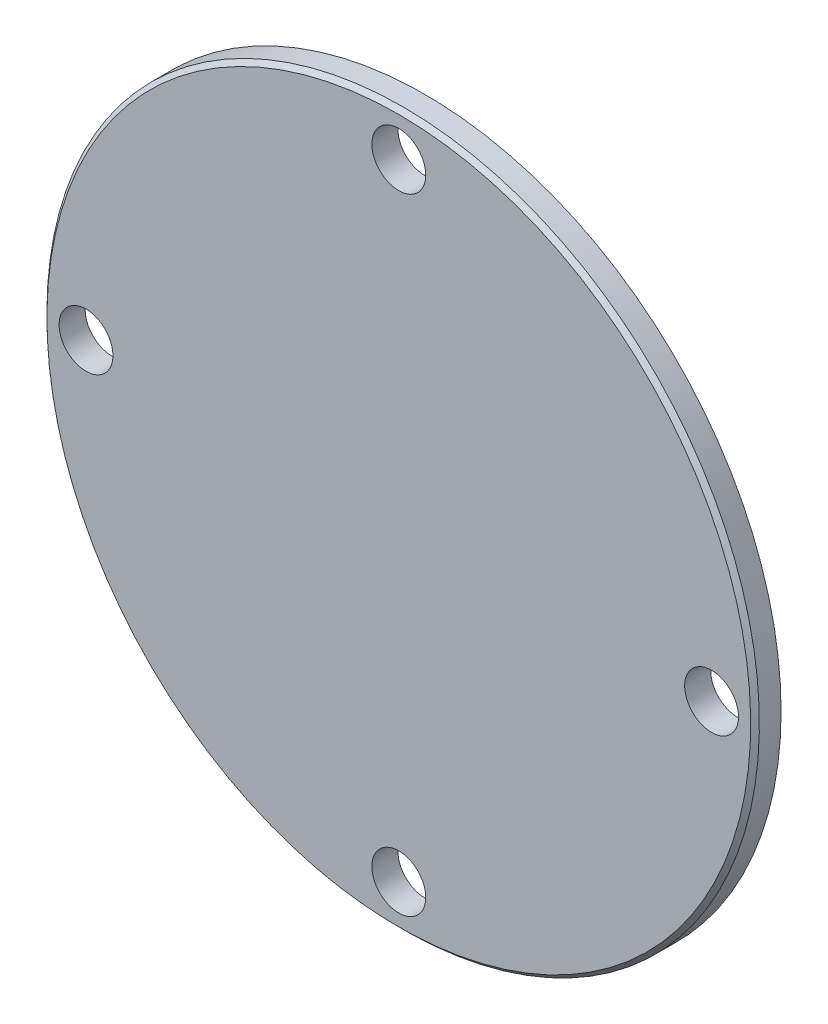
ISO-10303-21;
HEADER;
FILE_DESCRIPTION(('STEP AP214'),'2;1');
FILE_NAME('part.step','',(''),(''),'','','');
FILE_SCHEMA(('AUTOMOTIVE_DESIGN { 1 0 10303 214 1 1 1 1 }'));
ENDSEC;
DATA;
#1=APPLICATION_CONTEXT('core data for automotive mechanical design processes');
#2=APPLICATION_PROTOCOL_DEFINITION('international standard','automotive_design',2000,#1);
#3=PRODUCT_CONTEXT('',#1,'mechanical');
#4=PRODUCT('Part','Part','',(#3));
#5=PRODUCT_RELATED_PRODUCT_CATEGORY('part','',(#4));
#6=PRODUCT_DEFINITION_FORMATION('','',#4);
#7=PRODUCT_DEFINITION_CONTEXT('part definition',#1,'design');
#8=PRODUCT_DEFINITION('design','',#6,#7);
#9=PRODUCT_DEFINITION_SHAPE('','',#8);
#10=(LENGTH_UNIT() NAMED_UNIT(*) SI_UNIT(.MILLI.,.METRE.));
#11=(NAMED_UNIT(*) PLANE_ANGLE_UNIT() SI_UNIT($,.RADIAN.));
#12=(NAMED_UNIT(*) SI_UNIT($,.STERADIAN.) SOLID_ANGLE_UNIT());
#13=UNCERTAINTY_MEASURE_WITH_UNIT(LENGTH_MEASURE(1.E-05),#10,'distance_accuracy_value','');
#14=(GEOMETRIC_REPRESENTATION_CONTEXT(3) GLOBAL_UNCERTAINTY_ASSIGNED_CONTEXT((#13)) GLOBAL_UNIT_ASSIGNED_CONTEXT((#10,
#11,#12)) REPRESENTATION_CONTEXT('',''));
#15=CARTESIAN_POINT('',(0.,0.,0.));
#16=DIRECTION('',(0.,0.,1.));
#17=DIRECTION('',(1.,0.,0.));
#18=AXIS2_PLACEMENT_3D('',#15,#16,#17);
#19=CARTESIAN_POINT('',(0.,-36.,3.));
#20=DIRECTION('',(0.,0.,-1.));
#21=DIRECTION('',(0.,1.,0.));
#22=AXIS2_PLACEMENT_3D('',#19,#20,#21);
#23=CYLINDRICAL_SURFACE('',#22,3.1);
#24=CARTESIAN_POINT('',(0.,-36.,3.));
#25=DIRECTION('',(0.,0.,-1.));
#26=DIRECTION('',(0.,1.,0.));
#27=AXIS2_PLACEMENT_3D('',#24,#25,#26);
#28=CIRCLE('',#27,3.1);
#29=CARTESIAN_POINT('',(0.,-39.1,3.));
#30=VERTEX_POINT('',#29);
#31=EDGE_CURVE('E90',#30,#30,#28,.T.);
#32=ORIENTED_EDGE('',*,*,#31,.F.);
#33=DIRECTION('',(0.,0.,-1.));
#34=VECTOR('',#33,1.);
#35=CARTESIAN_POINT('',(0.,-39.1,3.));
#36=LINE('',#35,#34);
#37=CARTESIAN_POINT('',(0.,-39.1,0.));
#38=VERTEX_POINT('',#37);
#39=EDGE_CURVE('E11',#30,#38,#36,.T.);
#40=ORIENTED_EDGE('',*,*,#39,.T.);
#41=CARTESIAN_POINT('',(0.,-36.,0.));
#42=DIRECTION('',(0.,0.,-1.));
#43=DIRECTION('',(0.,1.,0.));
#44=AXIS2_PLACEMENT_3D('',#41,#42,#43);
#45=CIRCLE('',#44,3.1);
#46=EDGE_CURVE('E128',#38,#38,#45,.T.);
#47=ORIENTED_EDGE('',*,*,#46,.T.);
#48=ORIENTED_EDGE('',*,*,#39,.F.);
#49=EDGE_LOOP('',(#32,#40,#47,#48));
#50=FACE_BOUND('',#49,.T.);
#51=ADVANCED_FACE('F17',(#50),#23,.F.);
#52=CARTESIAN_POINT('',(-36.,0.,3.));
#53=DIRECTION('',(0.,0.,-1.));
#54=DIRECTION('',(1.,0.,0.));
#55=AXIS2_PLACEMENT_3D('',#52,#53,#54);
#56=CYLINDRICAL_SURFACE('',#55,3.1);
#57=CARTESIAN_POINT('',(-36.,0.,3.));
#58=DIRECTION('',(0.,0.,-1.));
#59=DIRECTION('',(1.,0.,0.));
#60=AXIS2_PLACEMENT_3D('',#57,#58,#59);
#61=CIRCLE('',#60,3.1);
#62=CARTESIAN_POINT('',(-39.1,0.,3.));
#63=VERTEX_POINT('',#62);
#64=EDGE_CURVE('E108',#63,#63,#61,.T.);
#65=ORIENTED_EDGE('',*,*,#64,.F.);
#66=DIRECTION('',(0.,0.,-1.));
#67=VECTOR('',#66,1.);
#68=CARTESIAN_POINT('',(-39.1,0.,3.));
#69=LINE('',#68,#67);
#70=CARTESIAN_POINT('',(-39.1,0.,0.));
#71=VERTEX_POINT('',#70);
#72=EDGE_CURVE('E20',#63,#71,#69,.T.);
#73=ORIENTED_EDGE('',*,*,#72,.T.);
#74=CARTESIAN_POINT('',(-36.,0.,0.));
#75=DIRECTION('',(0.,0.,-1.));
#76=DIRECTION('',(1.,0.,0.));
#77=AXIS2_PLACEMENT_3D('',#74,#75,#76);
#78=CIRCLE('',#77,3.1);
#79=EDGE_CURVE('E131',#71,#71,#78,.T.);
#80=ORIENTED_EDGE('',*,*,#79,.T.);
#81=ORIENTED_EDGE('',*,*,#72,.F.);
#82=EDGE_LOOP('',(#65,#73,#80,#81));
#83=FACE_BOUND('',#82,.T.);
#84=ADVANCED_FACE('F160',(#83),#56,.F.);
#85=CARTESIAN_POINT('',(0.,36.,3.));
#86=DIRECTION('',(0.,0.,-1.));
#87=DIRECTION('',(0.,-1.,0.));
#88=AXIS2_PLACEMENT_3D('',#85,#86,#87);
#89=CYLINDRICAL_SURFACE('',#88,3.1);
#90=CARTESIAN_POINT('',(0.,36.,3.));
#91=DIRECTION('',(0.,0.,-1.));
#92=DIRECTION('',(0.,-1.,0.));
#93=AXIS2_PLACEMENT_3D('',#90,#91,#92);
#94=CIRCLE('',#93,3.1);
#95=CARTESIAN_POINT('',(0.,39.1,3.));
#96=VERTEX_POINT('',#95);
#97=EDGE_CURVE('E115',#96,#96,#94,.T.);
#98=ORIENTED_EDGE('',*,*,#97,.F.);
#99=DIRECTION('',(0.,0.,-1.));
#100=VECTOR('',#99,1.);
#101=CARTESIAN_POINT('',(0.,39.1,3.));
#102=LINE('',#101,#100);
#103=CARTESIAN_POINT('',(0.,39.1,0.));
#104=VERTEX_POINT('',#103);
#105=EDGE_CURVE('E82',#96,#104,#102,.T.);
#106=ORIENTED_EDGE('',*,*,#105,.T.);
#107=CARTESIAN_POINT('',(0.,36.,0.));
#108=DIRECTION('',(0.,0.,-1.));
#109=DIRECTION('',(0.,-1.,0.));
#110=AXIS2_PLACEMENT_3D('',#107,#108,#109);
#111=CIRCLE('',#110,3.1);
#112=EDGE_CURVE('E125',#104,#104,#111,.T.);
#113=ORIENTED_EDGE('',*,*,#112,.T.);
#114=ORIENTED_EDGE('',*,*,#105,.F.);
#115=EDGE_LOOP('',(#98,#106,#113,#114));
#116=FACE_BOUND('',#115,.T.);
#117=ADVANCED_FACE('F220',(#116),#89,.F.);
#118=CARTESIAN_POINT('',(36.,0.,3.));
#119=DIRECTION('',(0.,0.,-1.));
#120=DIRECTION('',(-1.,0.,0.));
#121=AXIS2_PLACEMENT_3D('',#118,#119,#120);
#122=CYLINDRICAL_SURFACE('',#121,3.1);
#123=CARTESIAN_POINT('',(36.,0.,3.));
#124=DIRECTION('',(0.,0.,-1.));
#125=DIRECTION('',(-1.,0.,0.));
#126=AXIS2_PLACEMENT_3D('',#123,#124,#125);
#127=CIRCLE('',#126,3.1);
#128=CARTESIAN_POINT('',(39.1,0.,3.));
#129=VERTEX_POINT('',#128);
#130=EDGE_CURVE('E80',#129,#129,#127,.T.);
#131=ORIENTED_EDGE('',*,*,#130,.F.);
#132=DIRECTION('',(0.,0.,-1.));
#133=VECTOR('',#132,1.);
#134=CARTESIAN_POINT('',(39.1,0.,3.));
#135=LINE('',#134,#133);
#136=CARTESIAN_POINT('',(39.1,0.,0.));
#137=VERTEX_POINT('',#136);
#138=EDGE_CURVE('E40',#129,#137,#135,.T.);
#139=ORIENTED_EDGE('',*,*,#138,.T.);
#140=CARTESIAN_POINT('',(36.,0.,0.));
#141=DIRECTION('',(0.,0.,-1.));
#142=DIRECTION('',(-1.,0.,0.));
#143=AXIS2_PLACEMENT_3D('',#140,#141,#142);
#144=CIRCLE('',#143,3.1);
#145=EDGE_CURVE('E79',#137,#137,#144,.T.);
#146=ORIENTED_EDGE('',*,*,#145,.T.);
#147=ORIENTED_EDGE('',*,*,#138,.F.);
#148=EDGE_LOOP('',(#131,#139,#146,#147));
#149=FACE_BOUND('',#148,.T.);
#150=ADVANCED_FACE('F77',(#149),#122,.F.);
#151=CARTESIAN_POINT('',(0.,0.,3.));
#152=DIRECTION('',(0.,0.,1.));
#153=DIRECTION('',(1.,0.,0.));
#154=AXIS2_PLACEMENT_3D('',#151,#152,#153);
#155=PLANE('',#154);
#156=ORIENTED_EDGE('',*,*,#130,.T.);
#157=EDGE_LOOP('',(#156));
#158=FACE_BOUND('',#157,.T.);
#159=ORIENTED_EDGE('',*,*,#31,.T.);
#160=EDGE_LOOP('',(#159));
#161=FACE_BOUND('',#160,.T.);
#162=ORIENTED_EDGE('',*,*,#64,.T.);
#163=EDGE_LOOP('',(#162));
#164=FACE_BOUND('',#163,.T.);
#165=ORIENTED_EDGE('',*,*,#97,.T.);
#166=EDGE_LOOP('',(#165));
#167=FACE_BOUND('',#166,.T.);
#168=CARTESIAN_POINT('',(0.,0.,3.));
#169=DIRECTION('',(0.,0.,1.));
#170=DIRECTION('',(1.,0.,0.));
#171=AXIS2_PLACEMENT_3D('',#168,#169,#170);
#172=CIRCLE('',#171,40.5);
#173=CARTESIAN_POINT('',(0.,40.4999999999985,2.99999999999851));
#174=VERTEX_POINT('',#173);
#175=EDGE_CURVE('E94',#174,#174,#172,.T.);
#176=ORIENTED_EDGE('',*,*,#175,.T.);
#177=EDGE_LOOP('',(#176));
#178=FACE_BOUND('',#177,.T.);
#179=ADVANCED_FACE('F247',(#158,#161,#164,#167,#178),#155,.T.);
#180=CARTESIAN_POINT('',(0.,0.,2.750000000137));
#181=DIRECTION('',(0.,0.,-1.));
#182=DIRECTION('',(0.,-1.,0.));
#183=AXIS2_PLACEMENT_3D('',#180,#181,#182);
#184=CONICAL_SURFACE('',#183,40.74999999986,0.785398163397448);
#185=CARTESIAN_POINT('',(0.,0.,2.5));
#186=DIRECTION('',(0.,0.,1.));
#187=DIRECTION('',(1.,0.,0.));
#188=AXIS2_PLACEMENT_3D('',#185,#186,#187);
#189=CIRCLE('',#188,41.);
#190=CARTESIAN_POINT('',(-41.,0.,2.5));
#191=VERTEX_POINT('',#190);
#192=CARTESIAN_POINT('',(0.,40.9999999999985,2.4999999999985));
#193=VERTEX_POINT('',#192);
#194=EDGE_CURVE('E105',#191,#193,#189,.T.);
#195=ORIENTED_EDGE('',*,*,#194,.T.);
#196=DIRECTION('',(0.,-0.707106781186548,0.707106781186548));
#197=VECTOR('',#196,1.);
#198=CARTESIAN_POINT('',(0.,40.74999999986,2.750000000137));
#199=LINE('',#198,#197);
#200=EDGE_CURVE('E99',#193,#174,#199,.T.);
#201=ORIENTED_EDGE('',*,*,#200,.T.);
#202=ORIENTED_EDGE('',*,*,#175,.F.);
#203=ORIENTED_EDGE('',*,*,#200,.F.);
#204=CARTESIAN_POINT('',(0.,0.,2.5));
#205=DIRECTION('',(0.,0.,1.));
#206=DIRECTION('',(1.,0.,0.));
#207=AXIS2_PLACEMENT_3D('',#204,#205,#206);
#208=CIRCLE('',#207,41.);
#209=EDGE_CURVE('E103',#193,#191,#208,.T.);
#210=ORIENTED_EDGE('',*,*,#209,.T.);
#211=EDGE_LOOP('',(#195,#201,#202,#203,#210));
#212=FACE_BOUND('',#211,.T.);
#213=ADVANCED_FACE('F140',(#212),#184,.T.);
#214=CARTESIAN_POINT('',(0.,0.,0.));
#215=DIRECTION('',(0.,0.,1.));
#216=DIRECTION('',(1.,0.,0.));
#217=AXIS2_PLACEMENT_3D('',#214,#215,#216);
#218=CYLINDRICAL_SURFACE('',#217,41.);
#219=ORIENTED_EDGE('',*,*,#194,.F.);
#220=DIRECTION('',(0.,0.,-1.));
#221=VECTOR('',#220,1.);
#222=CARTESIAN_POINT('',(-41.,0.,0.));
#223=LINE('',#222,#221);
#224=CARTESIAN_POINT('',(-41.,0.,0.));
#225=VERTEX_POINT('',#224);
#226=EDGE_CURVE('E74',#191,#225,#223,.T.);
#227=ORIENTED_EDGE('',*,*,#226,.T.);
#228=CARTESIAN_POINT('',(0.,0.,0.));
#229=DIRECTION('',(0.,0.,1.));
#230=DIRECTION('',(1.,0.,0.));
#231=AXIS2_PLACEMENT_3D('',#228,#229,#230);
#232=CIRCLE('',#231,41.);
#233=EDGE_CURVE('E96',#225,#225,#232,.T.);
#234=ORIENTED_EDGE('',*,*,#233,.T.);
#235=ORIENTED_EDGE('',*,*,#226,.F.);
#236=ORIENTED_EDGE('',*,*,#209,.F.);
#237=EDGE_LOOP('',(#219,#227,#234,#235,#236));
#238=FACE_BOUND('',#237,.T.);
#239=ADVANCED_FACE('F146',(#238),#218,.T.);
#240=CARTESIAN_POINT('',(0.,0.,0.));
#241=DIRECTION('',(0.,0.,1.));
#242=DIRECTION('',(1.,0.,0.));
#243=AXIS2_PLACEMENT_3D('',#240,#241,#242);
#244=PLANE('',#243);
#245=ORIENTED_EDGE('',*,*,#46,.F.);
#246=EDGE_LOOP('',(#245));
#247=FACE_BOUND('',#246,.T.);
#248=ORIENTED_EDGE('',*,*,#79,.F.);
#249=EDGE_LOOP('',(#248));
#250=FACE_BOUND('',#249,.T.);
#251=ORIENTED_EDGE('',*,*,#112,.F.);
#252=EDGE_LOOP('',(#251));
#253=FACE_BOUND('',#252,.T.);
#254=ORIENTED_EDGE('',*,*,#145,.F.);
#255=EDGE_LOOP('',(#254));
#256=FACE_BOUND('',#255,.T.);
#257=ORIENTED_EDGE('',*,*,#233,.F.);
#258=EDGE_LOOP('',(#257));
#259=FACE_BOUND('',#258,.T.);
#260=ADVANCED_FACE('F222',(#247,#250,#253,#256,#259),#244,.F.);
#261=CLOSED_SHELL('',(#51,#84,#117,#150,#179,#213,#239,#260));
#262=MANIFOLD_SOLID_BREP('B1',#261);
#263=ADVANCED_BREP_SHAPE_REPRESENTATION('',(#18,#262),#14);
#264=SHAPE_DEFINITION_REPRESENTATION(#9,#263);
ENDSEC;
END-ISO-10303-21;
